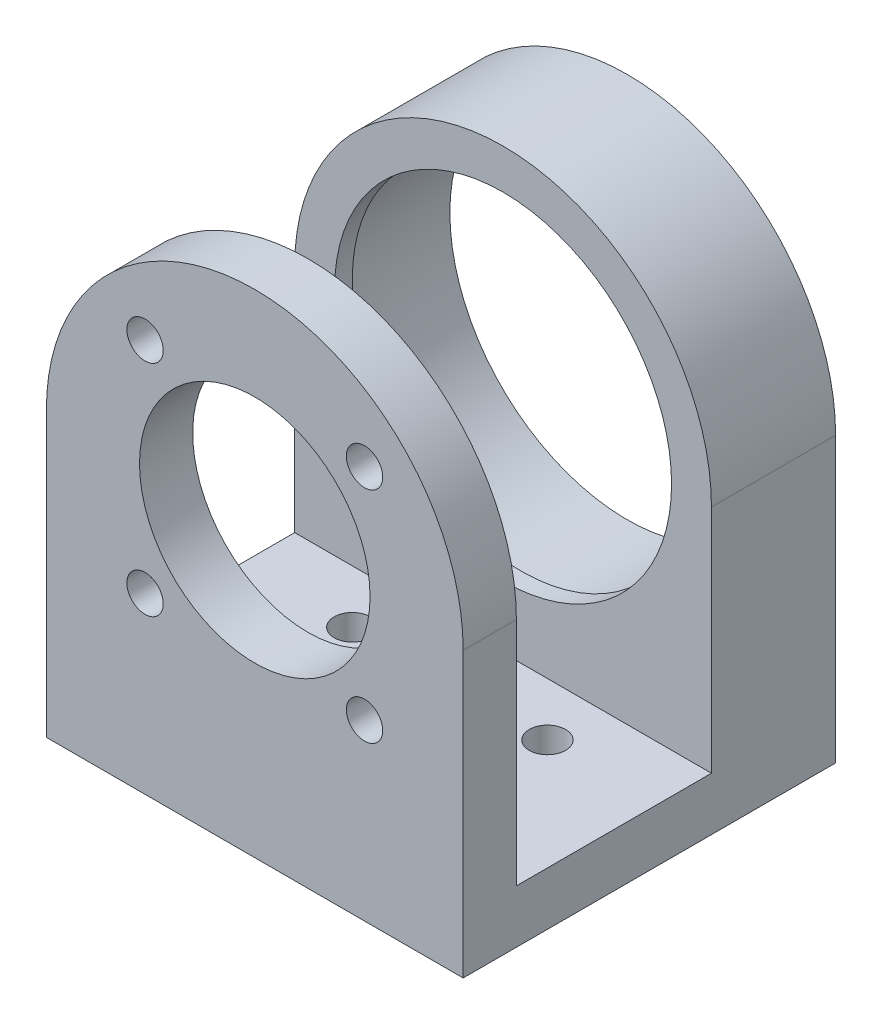
ISO-10303-21;
HEADER;
FILE_DESCRIPTION(('STEP AP214'),'2;1');
FILE_NAME('part.step','',(''),(''),'','','');
FILE_SCHEMA(('AUTOMOTIVE_DESIGN { 1 0 10303 214 1 1 1 1 }'));
ENDSEC;
DATA;
#1=APPLICATION_CONTEXT('core data for automotive mechanical design processes');
#2=APPLICATION_PROTOCOL_DEFINITION('international standard','automotive_design',2000,#1);
#3=PRODUCT_CONTEXT('',#1,'mechanical');
#4=PRODUCT('Part','Part','',(#3));
#5=PRODUCT_RELATED_PRODUCT_CATEGORY('part','',(#4));
#6=PRODUCT_DEFINITION_FORMATION('','',#4);
#7=PRODUCT_DEFINITION_CONTEXT('part definition',#1,'design');
#8=PRODUCT_DEFINITION('design','',#6,#7);
#9=PRODUCT_DEFINITION_SHAPE('','',#8);
#10=(LENGTH_UNIT() NAMED_UNIT(*) SI_UNIT(.MILLI.,.METRE.));
#11=(NAMED_UNIT(*) PLANE_ANGLE_UNIT() SI_UNIT($,.RADIAN.));
#12=(NAMED_UNIT(*) SI_UNIT($,.STERADIAN.) SOLID_ANGLE_UNIT());
#13=UNCERTAINTY_MEASURE_WITH_UNIT(LENGTH_MEASURE(1.E-05),#10,'distance_accuracy_value','');
#14=(GEOMETRIC_REPRESENTATION_CONTEXT(3) GLOBAL_UNCERTAINTY_ASSIGNED_CONTEXT((#13)) GLOBAL_UNIT_ASSIGNED_CONTEXT((#10,
#11,#12)) REPRESENTATION_CONTEXT('',''));
#15=CARTESIAN_POINT('',(0.,0.,0.));
#16=DIRECTION('',(0.,0.,1.));
#17=DIRECTION('',(1.,0.,0.));
#18=AXIS2_PLACEMENT_3D('',#15,#16,#17);
#19=CARTESIAN_POINT('',(-11.,10.,24.));
#20=DIRECTION('',(0.,1.,0.));
#21=DIRECTION('',(0.,0.,1.));
#22=AXIS2_PLACEMENT_3D('',#19,#20,#21);
#23=CYLINDRICAL_SURFACE('',#22,2.04999999999999);
#24=CARTESIAN_POINT('',(-11.,0.,24.));
#25=DIRECTION('',(0.,1.,0.));
#26=DIRECTION('',(0.,0.,1.));
#27=AXIS2_PLACEMENT_3D('',#24,#25,#26);
#28=CIRCLE('',#27,2.04999999999999);
#29=CARTESIAN_POINT('',(-11.,0.,26.05));
#30=VERTEX_POINT('',#29);
#31=EDGE_CURVE('E182',#30,#30,#28,.T.);
#32=ORIENTED_EDGE('',*,*,#31,.F.);
#33=EDGE_LOOP('',(#32));
#34=FACE_BOUND('',#33,.T.);
#35=CARTESIAN_POINT('',(-11.,6.,24.));
#36=DIRECTION('',(0.,1.,0.));
#37=DIRECTION('',(0.,0.,1.));
#38=AXIS2_PLACEMENT_3D('',#35,#36,#37);
#39=CIRCLE('',#38,2.04999999999999);
#40=CARTESIAN_POINT('',(-11.,6.,26.05));
#41=VERTEX_POINT('',#40);
#42=EDGE_CURVE('E163',#41,#41,#39,.F.);
#43=ORIENTED_EDGE('',*,*,#42,.F.);
#44=EDGE_LOOP('',(#43));
#45=FACE_BOUND('',#44,.T.);
#46=ADVANCED_FACE('F47',(#34,#45),#23,.F.);
#47=CARTESIAN_POINT('',(11.,10.,24.));
#48=DIRECTION('',(0.,1.,0.));
#49=DIRECTION('',(0.,0.,1.));
#50=AXIS2_PLACEMENT_3D('',#47,#48,#49);
#51=CYLINDRICAL_SURFACE('',#50,2.04999999999999);
#52=CARTESIAN_POINT('',(11.,0.,24.));
#53=DIRECTION('',(0.,1.,0.));
#54=DIRECTION('',(0.,0.,1.));
#55=AXIS2_PLACEMENT_3D('',#52,#53,#54);
#56=CIRCLE('',#55,2.04999999999999);
#57=CARTESIAN_POINT('',(11.,0.,26.05));
#58=VERTEX_POINT('',#57);
#59=EDGE_CURVE('E179',#58,#58,#56,.T.);
#60=ORIENTED_EDGE('',*,*,#59,.F.);
#61=EDGE_LOOP('',(#60));
#62=FACE_BOUND('',#61,.T.);
#63=CARTESIAN_POINT('',(11.,6.,24.));
#64=DIRECTION('',(0.,1.,0.));
#65=DIRECTION('',(0.,0.,1.));
#66=AXIS2_PLACEMENT_3D('',#63,#64,#65);
#67=CIRCLE('',#66,2.04999999999999);
#68=CARTESIAN_POINT('',(11.,6.,26.05));
#69=VERTEX_POINT('',#68);
#70=EDGE_CURVE('E160',#69,#69,#67,.F.);
#71=ORIENTED_EDGE('',*,*,#70,.F.);
#72=EDGE_LOOP('',(#71));
#73=FACE_BOUND('',#72,.T.);
#74=ADVANCED_FACE('F258',(#62,#73),#51,.F.);
#75=CARTESIAN_POINT('',(11.,10.,14.));
#76=DIRECTION('',(0.,1.,0.));
#77=DIRECTION('',(0.,0.,1.));
#78=AXIS2_PLACEMENT_3D('',#75,#76,#77);
#79=CYLINDRICAL_SURFACE('',#78,2.04999999999999);
#80=CARTESIAN_POINT('',(11.,0.,14.));
#81=DIRECTION('',(0.,1.,0.));
#82=DIRECTION('',(0.,0.,1.));
#83=AXIS2_PLACEMENT_3D('',#80,#81,#82);
#84=CIRCLE('',#83,2.04999999999999);
#85=CARTESIAN_POINT('',(11.,0.,16.05));
#86=VERTEX_POINT('',#85);
#87=EDGE_CURVE('E176',#86,#86,#84,.T.);
#88=ORIENTED_EDGE('',*,*,#87,.F.);
#89=EDGE_LOOP('',(#88));
#90=FACE_BOUND('',#89,.T.);
#91=CARTESIAN_POINT('',(11.,6.,14.));
#92=DIRECTION('',(0.,1.,0.));
#93=DIRECTION('',(0.,0.,1.));
#94=AXIS2_PLACEMENT_3D('',#91,#92,#93);
#95=CIRCLE('',#94,2.04999999999999);
#96=CARTESIAN_POINT('',(11.,6.,16.05));
#97=VERTEX_POINT('',#96);
#98=EDGE_CURVE('E157',#97,#97,#95,.F.);
#99=ORIENTED_EDGE('',*,*,#98,.F.);
#100=EDGE_LOOP('',(#99));
#101=FACE_BOUND('',#100,.T.);
#102=ADVANCED_FACE('F264',(#90,#101),#79,.F.);
#103=CARTESIAN_POINT('',(-11.,10.,14.));
#104=DIRECTION('',(0.,1.,0.));
#105=DIRECTION('',(0.,0.,1.));
#106=AXIS2_PLACEMENT_3D('',#103,#104,#105);
#107=CYLINDRICAL_SURFACE('',#106,2.04999999999999);
#108=CARTESIAN_POINT('',(-11.,0.,14.));
#109=DIRECTION('',(0.,1.,0.));
#110=DIRECTION('',(0.,0.,1.));
#111=AXIS2_PLACEMENT_3D('',#108,#109,#110);
#112=CIRCLE('',#111,2.04999999999999);
#113=CARTESIAN_POINT('',(-11.,0.,16.05));
#114=VERTEX_POINT('',#113);
#115=EDGE_CURVE('E173',#114,#114,#112,.T.);
#116=ORIENTED_EDGE('',*,*,#115,.F.);
#117=EDGE_LOOP('',(#116));
#118=FACE_BOUND('',#117,.T.);
#119=CARTESIAN_POINT('',(-11.,6.,14.));
#120=DIRECTION('',(0.,1.,0.));
#121=DIRECTION('',(0.,0.,1.));
#122=AXIS2_PLACEMENT_3D('',#119,#120,#121);
#123=CIRCLE('',#122,2.04999999999999);
#124=CARTESIAN_POINT('',(-11.,6.,16.05));
#125=VERTEX_POINT('',#124);
#126=EDGE_CURVE('E51',#125,#125,#123,.F.);
#127=ORIENTED_EDGE('',*,*,#126,.F.);
#128=EDGE_LOOP('',(#127));
#129=FACE_BOUND('',#128,.T.);
#130=ADVANCED_FACE('F327',(#118,#129),#107,.F.);
#131=CARTESIAN_POINT('',(0.,32.,36.));
#132=DIRECTION('',(0.,0.,-1.));
#133=DIRECTION('',(-1.,0.,0.));
#134=AXIS2_PLACEMENT_3D('',#131,#132,#133);
#135=CYLINDRICAL_SURFACE('',#134,23.5);
#136=DIRECTION('',(0.,0.,-1.));
#137=VECTOR('',#136,1.);
#138=CARTESIAN_POINT('',(23.5,32.,36.));
#139=LINE('',#138,#137);
#140=CARTESIAN_POINT('',(23.5,32.,36.));
#141=VERTEX_POINT('',#140);
#142=CARTESIAN_POINT('',(23.5,32.,30.));
#143=VERTEX_POINT('',#142);
#144=EDGE_CURVE('E122',#141,#143,#139,.T.);
#145=ORIENTED_EDGE('',*,*,#144,.T.);
#146=CARTESIAN_POINT('',(0.,32.,30.));
#147=DIRECTION('',(0.,0.,1.));
#148=DIRECTION('',(0.,-1.,0.));
#149=AXIS2_PLACEMENT_3D('',#146,#147,#148);
#150=CIRCLE('',#149,23.5);
#151=CARTESIAN_POINT('',(-23.5,32.,30.));
#152=VERTEX_POINT('',#151);
#153=EDGE_CURVE('E207',#143,#152,#150,.T.);
#154=ORIENTED_EDGE('',*,*,#153,.T.);
#155=DIRECTION('',(0.,0.,-1.));
#156=VECTOR('',#155,1.);
#157=CARTESIAN_POINT('',(-23.5,32.,36.));
#158=LINE('',#157,#156);
#159=CARTESIAN_POINT('',(-23.5,32.,36.));
#160=VERTEX_POINT('',#159);
#161=EDGE_CURVE('E11',#160,#152,#158,.T.);
#162=ORIENTED_EDGE('',*,*,#161,.F.);
#163=CARTESIAN_POINT('',(0.,32.,36.));
#164=DIRECTION('',(0.,0.,1.));
#165=DIRECTION('',(1.,0.,0.));
#166=AXIS2_PLACEMENT_3D('',#163,#164,#165);
#167=CIRCLE('',#166,23.5);
#168=EDGE_CURVE('E225',#141,#160,#167,.T.);
#169=ORIENTED_EDGE('',*,*,#168,.F.);
#170=EDGE_LOOP('',(#145,#154,#162,#169));
#171=FACE_BOUND('',#170,.T.);
#172=ADVANCED_FACE('F312',(#171),#135,.T.);
#173=CARTESIAN_POINT('',(0.,32.,7.99999999999999));
#174=DIRECTION('',(0.,0.,-1.));
#175=DIRECTION('',(0.,1.,0.));
#176=AXIS2_PLACEMENT_3D('',#173,#174,#175);
#177=CIRCLE('',#176,23.5);
#178=CARTESIAN_POINT('',(-23.5,32.,7.99999999999999));
#179=VERTEX_POINT('',#178);
#180=CARTESIAN_POINT('',(23.5,32.,7.99999999999999));
#181=VERTEX_POINT('',#180);
#182=EDGE_CURVE('E119',#179,#181,#177,.T.);
#183=ORIENTED_EDGE('',*,*,#182,.T.);
#184=CARTESIAN_POINT('',(23.5,32.,-6.));
#185=VERTEX_POINT('',#184);
#186=EDGE_CURVE('E114',#181,#185,#139,.T.);
#187=ORIENTED_EDGE('',*,*,#186,.T.);
#188=CARTESIAN_POINT('',(0.,32.,-6.));
#189=DIRECTION('',(0.,0.,-1.));
#190=DIRECTION('',(-1.,0.,0.));
#191=AXIS2_PLACEMENT_3D('',#188,#189,#190);
#192=CIRCLE('',#191,23.5);
#193=CARTESIAN_POINT('',(-23.5,32.,-6.));
#194=VERTEX_POINT('',#193);
#195=EDGE_CURVE('E118',#194,#185,#192,.T.);
#196=ORIENTED_EDGE('',*,*,#195,.F.);
#197=EDGE_CURVE('E56',#179,#194,#158,.T.);
#198=ORIENTED_EDGE('',*,*,#197,.F.);
#199=EDGE_LOOP('',(#183,#187,#196,#198));
#200=FACE_BOUND('',#199,.T.);
#201=ADVANCED_FACE('F49',(#200),#135,.T.);
#202=CARTESIAN_POINT('',(-23.5,32.,36.));
#203=DIRECTION('',(1.,0.,0.));
#204=DIRECTION('',(0.,1.,0.));
#205=AXIS2_PLACEMENT_3D('',#202,#203,#204);
#206=PLANE('',#205);
#207=DIRECTION('',(0.,0.,1.));
#208=VECTOR('',#207,1.);
#209=CARTESIAN_POINT('',(-23.5,6.,7.99999999999999));
#210=LINE('',#209,#208);
#211=CARTESIAN_POINT('',(-23.5,6.,7.99999999999999));
#212=VERTEX_POINT('',#211);
#213=CARTESIAN_POINT('',(-23.5,6.,30.));
#214=VERTEX_POINT('',#213);
#215=EDGE_CURVE('E145',#212,#214,#210,.T.);
#216=ORIENTED_EDGE('',*,*,#215,.F.);
#217=DIRECTION('',(0.,1.,0.));
#218=VECTOR('',#217,1.);
#219=CARTESIAN_POINT('',(-23.5,55.5,8.));
#220=LINE('',#219,#218);
#221=EDGE_CURVE('E188',#212,#179,#220,.T.);
#222=ORIENTED_EDGE('',*,*,#221,.T.);
#223=ORIENTED_EDGE('',*,*,#197,.T.);
#224=DIRECTION('',(0.,1.,0.));
#225=VECTOR('',#224,1.);
#226=CARTESIAN_POINT('',(-23.5,0.,-6.));
#227=LINE('',#226,#225);
#228=CARTESIAN_POINT('',(-23.5,0.,-6.));
#229=VERTEX_POINT('',#228);
#230=EDGE_CURVE('E137',#229,#194,#227,.T.);
#231=ORIENTED_EDGE('',*,*,#230,.F.);
#232=DIRECTION('',(0.,0.,-1.));
#233=VECTOR('',#232,1.);
#234=CARTESIAN_POINT('',(-23.5,0.,36.));
#235=LINE('',#234,#233);
#236=CARTESIAN_POINT('',(-23.5,0.,36.));
#237=VERTEX_POINT('',#236);
#238=EDGE_CURVE('E233',#237,#229,#235,.T.);
#239=ORIENTED_EDGE('',*,*,#238,.F.);
#240=DIRECTION('',(0.,-1.,0.));
#241=VECTOR('',#240,1.);
#242=CARTESIAN_POINT('',(-23.5,32.,36.));
#243=LINE('',#242,#241);
#244=EDGE_CURVE('E227',#160,#237,#243,.T.);
#245=ORIENTED_EDGE('',*,*,#244,.F.);
#246=ORIENTED_EDGE('',*,*,#161,.T.);
#247=DIRECTION('',(0.,-1.,0.));
#248=VECTOR('',#247,1.);
#249=CARTESIAN_POINT('',(-23.5,55.5,30.));
#250=LINE('',#249,#248);
#251=EDGE_CURVE('E186',#152,#214,#250,.T.);
#252=ORIENTED_EDGE('',*,*,#251,.T.);
#253=EDGE_LOOP('',(#216,#222,#223,#231,#239,#245,#246,#252));
#254=FACE_BOUND('',#253,.T.);
#255=ADVANCED_FACE('F305',(#254),#206,.F.);
#256=CARTESIAN_POINT('',(-23.5,0.,36.));
#257=DIRECTION('',(0.,1.,0.));
#258=DIRECTION('',(0.,0.,1.));
#259=AXIS2_PLACEMENT_3D('',#256,#257,#258);
#260=PLANE('',#259);
#261=ORIENTED_EDGE('',*,*,#115,.T.);
#262=EDGE_LOOP('',(#261));
#263=FACE_BOUND('',#262,.T.);
#264=ORIENTED_EDGE('',*,*,#87,.T.);
#265=EDGE_LOOP('',(#264));
#266=FACE_BOUND('',#265,.T.);
#267=ORIENTED_EDGE('',*,*,#59,.T.);
#268=EDGE_LOOP('',(#267));
#269=FACE_BOUND('',#268,.T.);
#270=ORIENTED_EDGE('',*,*,#31,.T.);
#271=EDGE_LOOP('',(#270));
#272=FACE_BOUND('',#271,.T.);
#273=ORIENTED_EDGE('',*,*,#238,.T.);
#274=DIRECTION('',(-1.,0.,0.));
#275=VECTOR('',#274,1.);
#276=CARTESIAN_POINT('',(23.5,0.,-6.));
#277=LINE('',#276,#275);
#278=CARTESIAN_POINT('',(23.5,0.,-6.));
#279=VERTEX_POINT('',#278);
#280=EDGE_CURVE('E131',#279,#229,#277,.T.);
#281=ORIENTED_EDGE('',*,*,#280,.F.);
#282=DIRECTION('',(0.,0.,-1.));
#283=VECTOR('',#282,1.);
#284=CARTESIAN_POINT('',(23.5,0.,36.));
#285=LINE('',#284,#283);
#286=CARTESIAN_POINT('',(23.5,0.,36.));
#287=VERTEX_POINT('',#286);
#288=EDGE_CURVE('E127',#287,#279,#285,.T.);
#289=ORIENTED_EDGE('',*,*,#288,.F.);
#290=DIRECTION('',(1.,0.,0.));
#291=VECTOR('',#290,1.);
#292=CARTESIAN_POINT('',(-23.5,0.,36.));
#293=LINE('',#292,#291);
#294=EDGE_CURVE('E69',#237,#287,#293,.T.);
#295=ORIENTED_EDGE('',*,*,#294,.F.);
#296=EDGE_LOOP('',(#273,#281,#289,#295));
#297=FACE_BOUND('',#296,.T.);
#298=ADVANCED_FACE('F303',(#263,#266,#269,#272,#297),#260,.F.);
#299=CARTESIAN_POINT('',(23.5,0.,36.));
#300=DIRECTION('',(-1.,0.,0.));
#301=DIRECTION('',(0.,-1.,0.));
#302=AXIS2_PLACEMENT_3D('',#299,#300,#301);
#303=PLANE('',#302);
#304=DIRECTION('',(0.,1.,0.));
#305=VECTOR('',#304,1.);
#306=CARTESIAN_POINT('',(23.5,55.5,8.));
#307=LINE('',#306,#305);
#308=CARTESIAN_POINT('',(23.5,6.,7.99999999999999));
#309=VERTEX_POINT('',#308);
#310=EDGE_CURVE('E189',#309,#181,#307,.T.);
#311=ORIENTED_EDGE('',*,*,#310,.F.);
#312=DIRECTION('',(0.,0.,-1.));
#313=VECTOR('',#312,1.);
#314=CARTESIAN_POINT('',(23.5,6.,7.99999999999999));
#315=LINE('',#314,#313);
#316=CARTESIAN_POINT('',(23.5,6.,30.));
#317=VERTEX_POINT('',#316);
#318=EDGE_CURVE('E151',#317,#309,#315,.T.);
#319=ORIENTED_EDGE('',*,*,#318,.F.);
#320=DIRECTION('',(0.,-1.,0.));
#321=VECTOR('',#320,1.);
#322=CARTESIAN_POINT('',(23.5,55.5,30.));
#323=LINE('',#322,#321);
#324=EDGE_CURVE('E185',#143,#317,#323,.T.);
#325=ORIENTED_EDGE('',*,*,#324,.F.);
#326=ORIENTED_EDGE('',*,*,#144,.F.);
#327=DIRECTION('',(0.,1.,0.));
#328=VECTOR('',#327,1.);
#329=CARTESIAN_POINT('',(23.5,0.,36.));
#330=LINE('',#329,#328);
#331=EDGE_CURVE('E64',#287,#141,#330,.T.);
#332=ORIENTED_EDGE('',*,*,#331,.F.);
#333=ORIENTED_EDGE('',*,*,#288,.T.);
#334=DIRECTION('',(0.,-1.,0.));
#335=VECTOR('',#334,1.);
#336=CARTESIAN_POINT('',(23.5,32.,-6.));
#337=LINE('',#336,#335);
#338=EDGE_CURVE('E125',#185,#279,#337,.T.);
#339=ORIENTED_EDGE('',*,*,#338,.F.);
#340=ORIENTED_EDGE('',*,*,#186,.F.);
#341=EDGE_LOOP('',(#311,#319,#325,#326,#332,#333,#339,#340));
#342=FACE_BOUND('',#341,.T.);
#343=ADVANCED_FACE('F126',(#342),#303,.F.);
#344=CARTESIAN_POINT('',(0.,32.,36.));
#345=DIRECTION('',(0.,0.,1.));
#346=DIRECTION('',(1.,0.,0.));
#347=AXIS2_PLACEMENT_3D('',#344,#345,#346);
#348=PLANE('',#347);
#349=CARTESIAN_POINT('',(-12.3743686707646,44.3743686707646,36.));
#350=DIRECTION('',(0.,0.,1.));
#351=DIRECTION('',(1.,0.,0.));
#352=AXIS2_PLACEMENT_3D('',#349,#350,#351);
#353=CIRCLE('',#352,2.04999999999999);
#354=CARTESIAN_POINT('',(-10.3243686707646,44.3743686707646,36.));
#355=VERTEX_POINT('',#354);
#356=EDGE_CURVE('E210',#355,#355,#353,.T.);
#357=ORIENTED_EDGE('',*,*,#356,.F.);
#358=EDGE_LOOP('',(#357));
#359=FACE_BOUND('',#358,.T.);
#360=CARTESIAN_POINT('',(12.3743686707646,44.3743686707646,36.));
#361=DIRECTION('',(0.,0.,1.));
#362=DIRECTION('',(1.,0.,0.));
#363=AXIS2_PLACEMENT_3D('',#360,#361,#362);
#364=CIRCLE('',#363,2.04999999999999);
#365=CARTESIAN_POINT('',(14.4243686707646,44.3743686707646,36.));
#366=VERTEX_POINT('',#365);
#367=EDGE_CURVE('E213',#366,#366,#364,.T.);
#368=ORIENTED_EDGE('',*,*,#367,.F.);
#369=EDGE_LOOP('',(#368));
#370=FACE_BOUND('',#369,.T.);
#371=CARTESIAN_POINT('',(-12.3743686707646,19.6256313292354,36.));
#372=DIRECTION('',(0.,0.,1.));
#373=DIRECTION('',(1.,0.,0.));
#374=AXIS2_PLACEMENT_3D('',#371,#372,#373);
#375=CIRCLE('',#374,2.04999999999999);
#376=CARTESIAN_POINT('',(-10.3243686707646,19.6256313292354,36.));
#377=VERTEX_POINT('',#376);
#378=EDGE_CURVE('E216',#377,#377,#375,.T.);
#379=ORIENTED_EDGE('',*,*,#378,.F.);
#380=EDGE_LOOP('',(#379));
#381=FACE_BOUND('',#380,.T.);
#382=CARTESIAN_POINT('',(12.3743686707646,19.6256313292354,36.));
#383=DIRECTION('',(0.,0.,1.));
#384=DIRECTION('',(1.,0.,0.));
#385=AXIS2_PLACEMENT_3D('',#382,#383,#384);
#386=CIRCLE('',#385,2.04999999999999);
#387=CARTESIAN_POINT('',(14.4243686707646,19.6256313292354,36.));
#388=VERTEX_POINT('',#387);
#389=EDGE_CURVE('E219',#388,#388,#386,.T.);
#390=ORIENTED_EDGE('',*,*,#389,.F.);
#391=EDGE_LOOP('',(#390));
#392=FACE_BOUND('',#391,.T.);
#393=CARTESIAN_POINT('',(0.,32.,36.));
#394=DIRECTION('',(0.,0.,1.));
#395=DIRECTION('',(1.,0.,0.));
#396=AXIS2_PLACEMENT_3D('',#393,#394,#395);
#397=CIRCLE('',#396,13.);
#398=CARTESIAN_POINT('',(13.,32.,36.));
#399=VERTEX_POINT('',#398);
#400=EDGE_CURVE('E222',#399,#399,#397,.T.);
#401=ORIENTED_EDGE('',*,*,#400,.F.);
#402=EDGE_LOOP('',(#401));
#403=FACE_BOUND('',#402,.T.);
#404=ORIENTED_EDGE('',*,*,#168,.T.);
#405=ORIENTED_EDGE('',*,*,#244,.T.);
#406=ORIENTED_EDGE('',*,*,#294,.T.);
#407=ORIENTED_EDGE('',*,*,#331,.T.);
#408=EDGE_LOOP('',(#404,#405,#406,#407));
#409=FACE_BOUND('',#408,.T.);
#410=ADVANCED_FACE('F296',(#359,#370,#381,#392,#403,#409),#348,.T.);
#411=CARTESIAN_POINT('',(0.,32.,16.));
#412=DIRECTION('',(0.,0.,1.));
#413=DIRECTION('',(1.,0.,0.));
#414=AXIS2_PLACEMENT_3D('',#411,#412,#413);
#415=CYLINDRICAL_SURFACE('',#414,13.);
#416=CARTESIAN_POINT('',(0.,32.,30.));
#417=DIRECTION('',(0.,0.,1.));
#418=DIRECTION('',(0.,-1.,0.));
#419=AXIS2_PLACEMENT_3D('',#416,#417,#418);
#420=CIRCLE('',#419,13.);
#421=CARTESIAN_POINT('',(0.,19.,30.));
#422=VERTEX_POINT('',#421);
#423=EDGE_CURVE('E204',#422,#422,#420,.F.);
#424=ORIENTED_EDGE('',*,*,#423,.T.);
#425=EDGE_LOOP('',(#424));
#426=FACE_BOUND('',#425,.T.);
#427=ORIENTED_EDGE('',*,*,#400,.T.);
#428=EDGE_LOOP('',(#427));
#429=FACE_BOUND('',#428,.T.);
#430=ADVANCED_FACE('F292',(#426,#429),#415,.F.);
#431=CARTESIAN_POINT('',(12.3743686707646,19.6256313292354,36.));
#432=DIRECTION('',(0.,0.,1.));
#433=DIRECTION('',(1.,0.,0.));
#434=AXIS2_PLACEMENT_3D('',#431,#432,#433);
#435=CYLINDRICAL_SURFACE('',#434,2.04999999999999);
#436=CARTESIAN_POINT('',(12.3743686707646,19.6256313292354,30.));
#437=DIRECTION('',(0.,0.,1.));
#438=DIRECTION('',(0.,-1.,0.));
#439=AXIS2_PLACEMENT_3D('',#436,#437,#438);
#440=CIRCLE('',#439,2.04999999999999);
#441=CARTESIAN_POINT('',(12.3743686707646,17.5756313292355,30.));
#442=VERTEX_POINT('',#441);
#443=EDGE_CURVE('E201',#442,#442,#440,.F.);
#444=ORIENTED_EDGE('',*,*,#443,.T.);
#445=EDGE_LOOP('',(#444));
#446=FACE_BOUND('',#445,.T.);
#447=ORIENTED_EDGE('',*,*,#389,.T.);
#448=EDGE_LOOP('',(#447));
#449=FACE_BOUND('',#448,.T.);
#450=ADVANCED_FACE('F288',(#446,#449),#435,.F.);
#451=CARTESIAN_POINT('',(-12.3743686707646,19.6256313292354,36.));
#452=DIRECTION('',(0.,0.,1.));
#453=DIRECTION('',(1.,0.,0.));
#454=AXIS2_PLACEMENT_3D('',#451,#452,#453);
#455=CYLINDRICAL_SURFACE('',#454,2.04999999999999);
#456=CARTESIAN_POINT('',(-12.3743686707646,19.6256313292354,30.));
#457=DIRECTION('',(0.,0.,1.));
#458=DIRECTION('',(0.,-1.,0.));
#459=AXIS2_PLACEMENT_3D('',#456,#457,#458);
#460=CIRCLE('',#459,2.04999999999999);
#461=CARTESIAN_POINT('',(-12.3743686707646,17.5756313292355,30.));
#462=VERTEX_POINT('',#461);
#463=EDGE_CURVE('E198',#462,#462,#460,.F.);
#464=ORIENTED_EDGE('',*,*,#463,.T.);
#465=EDGE_LOOP('',(#464));
#466=FACE_BOUND('',#465,.T.);
#467=ORIENTED_EDGE('',*,*,#378,.T.);
#468=EDGE_LOOP('',(#467));
#469=FACE_BOUND('',#468,.T.);
#470=ADVANCED_FACE('F284',(#466,#469),#455,.F.);
#471=CARTESIAN_POINT('',(12.3743686707646,44.3743686707646,36.));
#472=DIRECTION('',(0.,0.,1.));
#473=DIRECTION('',(1.,0.,0.));
#474=AXIS2_PLACEMENT_3D('',#471,#472,#473);
#475=CYLINDRICAL_SURFACE('',#474,2.04999999999999);
#476=CARTESIAN_POINT('',(12.3743686707646,44.3743686707646,30.));
#477=DIRECTION('',(0.,0.,1.));
#478=DIRECTION('',(0.,-1.,0.));
#479=AXIS2_PLACEMENT_3D('',#476,#477,#478);
#480=CIRCLE('',#479,2.04999999999999);
#481=CARTESIAN_POINT('',(12.3743686707646,42.3243686707646,30.));
#482=VERTEX_POINT('',#481);
#483=EDGE_CURVE('E195',#482,#482,#480,.F.);
#484=ORIENTED_EDGE('',*,*,#483,.T.);
#485=EDGE_LOOP('',(#484));
#486=FACE_BOUND('',#485,.T.);
#487=ORIENTED_EDGE('',*,*,#367,.T.);
#488=EDGE_LOOP('',(#487));
#489=FACE_BOUND('',#488,.T.);
#490=ADVANCED_FACE('F280',(#486,#489),#475,.F.);
#491=CARTESIAN_POINT('',(-12.3743686707646,44.3743686707646,36.));
#492=DIRECTION('',(0.,0.,1.));
#493=DIRECTION('',(1.,0.,0.));
#494=AXIS2_PLACEMENT_3D('',#491,#492,#493);
#495=CYLINDRICAL_SURFACE('',#494,2.04999999999999);
#496=CARTESIAN_POINT('',(-12.3743686707646,44.3743686707646,30.));
#497=DIRECTION('',(0.,0.,1.));
#498=DIRECTION('',(0.,-1.,0.));
#499=AXIS2_PLACEMENT_3D('',#496,#497,#498);
#500=CIRCLE('',#499,2.04999999999999);
#501=CARTESIAN_POINT('',(-12.3743686707646,42.3243686707646,30.));
#502=VERTEX_POINT('',#501);
#503=EDGE_CURVE('E192',#502,#502,#500,.F.);
#504=ORIENTED_EDGE('',*,*,#503,.T.);
#505=EDGE_LOOP('',(#504));
#506=FACE_BOUND('',#505,.T.);
#507=ORIENTED_EDGE('',*,*,#356,.T.);
#508=EDGE_LOOP('',(#507));
#509=FACE_BOUND('',#508,.T.);
#510=ADVANCED_FACE('F274',(#506,#509),#495,.F.);
#511=CARTESIAN_POINT('',(-23.5,55.5,8.));
#512=DIRECTION('',(0.,0.,-1.));
#513=DIRECTION('',(0.,1.,0.));
#514=AXIS2_PLACEMENT_3D('',#511,#512,#513);
#515=PLANE('',#514);
#516=CARTESIAN_POINT('',(0.,32.,7.99999999999999));
#517=DIRECTION('',(0.,0.,-1.));
#518=DIRECTION('',(0.,1.,0.));
#519=AXIS2_PLACEMENT_3D('',#516,#517,#518);
#520=CIRCLE('',#519,19.);
#521=CARTESIAN_POINT('',(0.,51.,8.));
#522=VERTEX_POINT('',#521);
#523=EDGE_CURVE('E169',#522,#522,#520,.T.);
#524=ORIENTED_EDGE('',*,*,#523,.T.);
#525=EDGE_LOOP('',(#524));
#526=FACE_BOUND('',#525,.T.);
#527=ORIENTED_EDGE('',*,*,#182,.F.);
#528=ORIENTED_EDGE('',*,*,#221,.F.);
#529=DIRECTION('',(-1.,0.,0.));
#530=VECTOR('',#529,1.);
#531=CARTESIAN_POINT('',(-23.5,6.,7.99999999999999));
#532=LINE('',#531,#530);
#533=EDGE_CURVE('E154',#309,#212,#532,.T.);
#534=ORIENTED_EDGE('',*,*,#533,.F.);
#535=ORIENTED_EDGE('',*,*,#310,.T.);
#536=EDGE_LOOP('',(#527,#528,#534,#535));
#537=FACE_BOUND('',#536,.T.);
#538=ADVANCED_FACE('F239',(#526,#537),#515,.F.);
#539=CARTESIAN_POINT('',(-23.5,55.5,30.));
#540=DIRECTION('',(0.,0.,1.));
#541=DIRECTION('',(0.,-1.,0.));
#542=AXIS2_PLACEMENT_3D('',#539,#540,#541);
#543=PLANE('',#542);
#544=ORIENTED_EDGE('',*,*,#443,.F.);
#545=EDGE_LOOP('',(#544));
#546=FACE_BOUND('',#545,.T.);
#547=ORIENTED_EDGE('',*,*,#483,.F.);
#548=EDGE_LOOP('',(#547));
#549=FACE_BOUND('',#548,.T.);
#550=ORIENTED_EDGE('',*,*,#503,.F.);
#551=EDGE_LOOP('',(#550));
#552=FACE_BOUND('',#551,.T.);
#553=ORIENTED_EDGE('',*,*,#463,.F.);
#554=EDGE_LOOP('',(#553));
#555=FACE_BOUND('',#554,.T.);
#556=ORIENTED_EDGE('',*,*,#423,.F.);
#557=EDGE_LOOP('',(#556));
#558=FACE_BOUND('',#557,.T.);
#559=ORIENTED_EDGE('',*,*,#324,.T.);
#560=DIRECTION('',(1.,0.,0.));
#561=VECTOR('',#560,1.);
#562=CARTESIAN_POINT('',(-23.5,6.,30.));
#563=LINE('',#562,#561);
#564=EDGE_CURVE('E148',#214,#317,#563,.T.);
#565=ORIENTED_EDGE('',*,*,#564,.F.);
#566=ORIENTED_EDGE('',*,*,#251,.F.);
#567=ORIENTED_EDGE('',*,*,#153,.F.);
#568=EDGE_LOOP('',(#559,#565,#566,#567));
#569=FACE_BOUND('',#568,.T.);
#570=ADVANCED_FACE('F273',(#546,#549,#552,#555,#558,#569),#543,.F.);
#571=CARTESIAN_POINT('',(0.,32.,6.));
#572=DIRECTION('',(0.,0.,-1.));
#573=DIRECTION('',(-1.,0.,0.));
#574=AXIS2_PLACEMENT_3D('',#571,#572,#573);
#575=CYLINDRICAL_SURFACE('',#574,20.);
#576=CARTESIAN_POINT('',(0.,32.,6.));
#577=DIRECTION('',(0.,0.,-1.));
#578=DIRECTION('',(-1.,0.,0.));
#579=AXIS2_PLACEMENT_3D('',#576,#577,#578);
#580=CIRCLE('',#579,20.);
#581=CARTESIAN_POINT('',(-20.,32.,6.));
#582=VERTEX_POINT('',#581);
#583=EDGE_CURVE('E170',#582,#582,#580,.T.);
#584=ORIENTED_EDGE('',*,*,#583,.F.);
#585=EDGE_LOOP('',(#584));
#586=FACE_BOUND('',#585,.T.);
#587=CARTESIAN_POINT('',(0.,32.,-6.));
#588=DIRECTION('',(0.,0.,-1.));
#589=DIRECTION('',(-1.,0.,0.));
#590=AXIS2_PLACEMENT_3D('',#587,#588,#589);
#591=CIRCLE('',#590,20.);
#592=CARTESIAN_POINT('',(-20.,32.,-6.));
#593=VERTEX_POINT('',#592);
#594=EDGE_CURVE('E138',#593,#593,#591,.T.);
#595=ORIENTED_EDGE('',*,*,#594,.T.);
#596=EDGE_LOOP('',(#595));
#597=FACE_BOUND('',#596,.T.);
#598=ADVANCED_FACE('F254',(#586,#597),#575,.F.);
#599=CARTESIAN_POINT('',(0.,32.,6.));
#600=DIRECTION('',(0.,0.,-1.));
#601=DIRECTION('',(-1.,0.,0.));
#602=AXIS2_PLACEMENT_3D('',#599,#600,#601);
#603=PLANE('',#602);
#604=CARTESIAN_POINT('',(0.,32.,6.));
#605=DIRECTION('',(0.,0.,-1.));
#606=DIRECTION('',(-1.,0.,0.));
#607=AXIS2_PLACEMENT_3D('',#604,#605,#606);
#608=CIRCLE('',#607,19.);
#609=CARTESIAN_POINT('',(-19.,32.,6.));
#610=VERTEX_POINT('',#609);
#611=EDGE_CURVE('E166',#610,#610,#608,.T.);
#612=ORIENTED_EDGE('',*,*,#611,.F.);
#613=EDGE_LOOP('',(#612));
#614=FACE_BOUND('',#613,.T.);
#615=ORIENTED_EDGE('',*,*,#583,.T.);
#616=EDGE_LOOP('',(#615));
#617=FACE_BOUND('',#616,.T.);
#618=ADVANCED_FACE('F245',(#614,#617),#603,.T.);
#619=CARTESIAN_POINT('',(0.,32.,16.));
#620=DIRECTION('',(0.,0.,-1.));
#621=DIRECTION('',(-1.,0.,0.));
#622=AXIS2_PLACEMENT_3D('',#619,#620,#621);
#623=CYLINDRICAL_SURFACE('',#622,19.);
#624=ORIENTED_EDGE('',*,*,#611,.T.);
#625=EDGE_LOOP('',(#624));
#626=FACE_BOUND('',#625,.T.);
#627=ORIENTED_EDGE('',*,*,#523,.F.);
#628=EDGE_LOOP('',(#627));
#629=FACE_BOUND('',#628,.T.);
#630=ADVANCED_FACE('F242',(#626,#629),#623,.F.);
#631=CARTESIAN_POINT('',(0.,6.,0.));
#632=DIRECTION('',(0.,1.,0.));
#633=DIRECTION('',(0.,0.,1.));
#634=AXIS2_PLACEMENT_3D('',#631,#632,#633);
#635=PLANE('',#634);
#636=ORIENTED_EDGE('',*,*,#215,.T.);
#637=ORIENTED_EDGE('',*,*,#564,.T.);
#638=ORIENTED_EDGE('',*,*,#318,.T.);
#639=ORIENTED_EDGE('',*,*,#533,.T.);
#640=EDGE_LOOP('',(#636,#637,#638,#639));
#641=FACE_BOUND('',#640,.T.);
#642=ORIENTED_EDGE('',*,*,#126,.T.);
#643=EDGE_LOOP('',(#642));
#644=FACE_BOUND('',#643,.T.);
#645=ORIENTED_EDGE('',*,*,#98,.T.);
#646=EDGE_LOOP('',(#645));
#647=FACE_BOUND('',#646,.T.);
#648=ORIENTED_EDGE('',*,*,#70,.T.);
#649=EDGE_LOOP('',(#648));
#650=FACE_BOUND('',#649,.T.);
#651=ORIENTED_EDGE('',*,*,#42,.T.);
#652=EDGE_LOOP('',(#651));
#653=FACE_BOUND('',#652,.T.);
#654=ADVANCED_FACE('F244',(#641,#644,#647,#650,#653),#635,.T.);
#655=CARTESIAN_POINT('',(0.,32.,-6.));
#656=DIRECTION('',(0.,0.,-1.));
#657=DIRECTION('',(-1.,0.,0.));
#658=AXIS2_PLACEMENT_3D('',#655,#656,#657);
#659=PLANE('',#658);
#660=ORIENTED_EDGE('',*,*,#195,.T.);
#661=ORIENTED_EDGE('',*,*,#338,.T.);
#662=ORIENTED_EDGE('',*,*,#280,.T.);
#663=ORIENTED_EDGE('',*,*,#230,.T.);
#664=EDGE_LOOP('',(#660,#661,#662,#663));
#665=FACE_BOUND('',#664,.T.);
#666=ORIENTED_EDGE('',*,*,#594,.F.);
#667=EDGE_LOOP('',(#666));
#668=FACE_BOUND('',#667,.T.);
#669=ADVANCED_FACE('F134',(#665,#668),#659,.T.);
#670=CLOSED_SHELL('',(#46,#74,#102,#130,#172,#201,#255,#298,#343,#410,#430,#450,#470,#490,#510,
#538,#570,#598,#618,#630,#654,#669));
#671=MANIFOLD_SOLID_BREP('B2',#670);
#672=ADVANCED_BREP_SHAPE_REPRESENTATION('',(#18,#671),#14);
#673=SHAPE_DEFINITION_REPRESENTATION(#9,#672);
ENDSEC;
END-ISO-10303-21;
